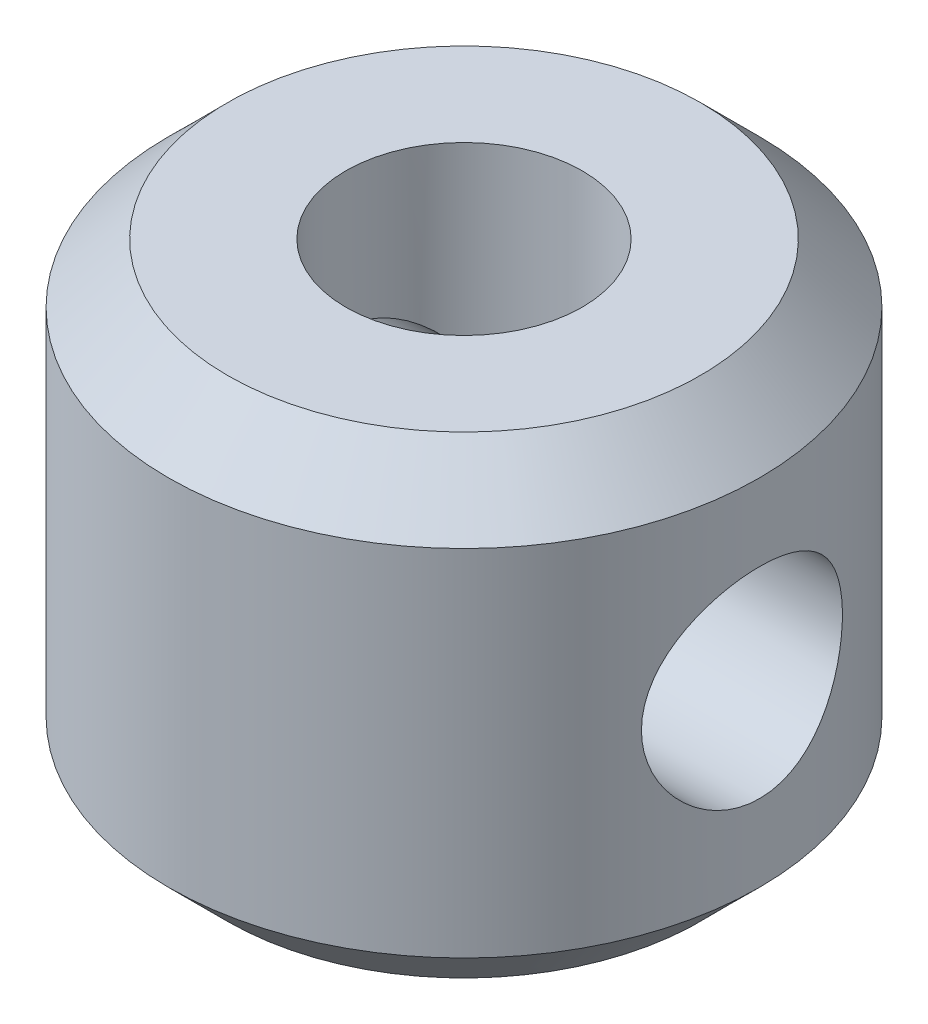
ISO-10303-21;
HEADER;
FILE_DESCRIPTION(('STEP AP214'),'2;1');
FILE_NAME('part.step','',(''),(''),'','','');
FILE_SCHEMA(('AUTOMOTIVE_DESIGN { 1 0 10303 214 1 1 1 1 }'));
ENDSEC;
DATA;
#1=APPLICATION_CONTEXT('core data for automotive mechanical design processes');
#2=APPLICATION_PROTOCOL_DEFINITION('international standard','automotive_design',2000,#1);
#3=PRODUCT_CONTEXT('',#1,'mechanical');
#4=PRODUCT('Part','Part','',(#3));
#5=PRODUCT_RELATED_PRODUCT_CATEGORY('part','',(#4));
#6=PRODUCT_DEFINITION_FORMATION('','',#4);
#7=PRODUCT_DEFINITION_CONTEXT('part definition',#1,'design');
#8=PRODUCT_DEFINITION('design','',#6,#7);
#9=PRODUCT_DEFINITION_SHAPE('','',#8);
#10=(LENGTH_UNIT() NAMED_UNIT(*) SI_UNIT(.MILLI.,.METRE.));
#11=(NAMED_UNIT(*) PLANE_ANGLE_UNIT() SI_UNIT($,.RADIAN.));
#12=(NAMED_UNIT(*) SI_UNIT($,.STERADIAN.) SOLID_ANGLE_UNIT());
#13=UNCERTAINTY_MEASURE_WITH_UNIT(LENGTH_MEASURE(1.E-05),#10,'distance_accuracy_value','');
#14=(GEOMETRIC_REPRESENTATION_CONTEXT(3) GLOBAL_UNCERTAINTY_ASSIGNED_CONTEXT((#13)) GLOBAL_UNIT_ASSIGNED_CONTEXT((#10,
#11,#12)) REPRESENTATION_CONTEXT('',''));
#15=CARTESIAN_POINT('',(0.,0.,0.));
#16=DIRECTION('',(0.,0.,1.));
#17=DIRECTION('',(1.,0.,0.));
#18=AXIS2_PLACEMENT_3D('',#15,#16,#17);
#19=CARTESIAN_POINT('',(0.,-8.,0.));
#20=DIRECTION('',(0.,1.,0.));
#21=DIRECTION('',(0.,0.,1.));
#22=AXIS2_PLACEMENT_3D('',#19,#20,#21);
#23=CYLINDRICAL_SURFACE('',#22,10.);
#24=CARTESIAN_POINT('',(0.,-6.,0.));
#25=DIRECTION('',(0.,1.,0.));
#26=DIRECTION('',(0.,0.,1.));
#27=AXIS2_PLACEMENT_3D('',#24,#25,#26);
#28=CIRCLE('',#27,10.);
#29=CARTESIAN_POINT('',(0.,-6.,10.));
#30=VERTEX_POINT('',#29);
#31=EDGE_CURVE('E51',#30,#30,#28,.T.);
#32=ORIENTED_EDGE('',*,*,#31,.T.);
#33=EDGE_LOOP('',(#32));
#34=FACE_BOUND('',#33,.T.);
#35=CARTESIAN_POINT('',(0.,5.99999999999998,0.));
#36=DIRECTION('',(0.,1.,0.));
#37=DIRECTION('',(0.,0.,1.));
#38=AXIS2_PLACEMENT_3D('',#35,#36,#37);
#39=CIRCLE('',#38,10.);
#40=CARTESIAN_POINT('',(0.,5.99999999999998,10.));
#41=VERTEX_POINT('',#40);
#42=EDGE_CURVE('E55',#41,#41,#39,.F.);
#43=ORIENTED_EDGE('',*,*,#42,.T.);
#44=EDGE_LOOP('',(#43));
#45=FACE_BOUND('',#44,.T.);
#46=CARTESIAN_POINT('',(-9.404254356407,0.,3.4));
#47=CARTESIAN_POINT('',(-9.40425304388512,-0.184953420483376,3.40000166908751));
#48=CARTESIAN_POINT('',(-9.40977016252886,-0.369895511118645,3.38485741847302));
#49=CARTESIAN_POINT('',(-9.43112195412395,-0.734285524505208,3.32489550119485));
#50=CARTESIAN_POINT('',(-9.44695798538134,-0.91373272069255,3.28007392801337));
#51=CARTESIAN_POINT('',(-9.486950978287,-1.26179216911297,3.16252582092778));
#52=CARTESIAN_POINT('',(-9.51109108494813,-1.43042555412138,3.08985577794442));
#53=CARTESIAN_POINT('',(-9.56494733634185,-1.75316390833695,2.91886772573691));
#54=CARTESIAN_POINT('',(-9.59466478704886,-1.90726546208992,2.82054370734523));
#55=CARTESIAN_POINT('',(-9.65768445866953,-2.20284172907647,2.59674934389341));
#56=CARTESIAN_POINT('',(-9.69107860913661,-2.34363869593089,2.47040953086171));
#57=CARTESIAN_POINT('',(-9.75691356862043,-2.60251129740331,2.19602382297905));
#58=CARTESIAN_POINT('',(-9.78935421670139,-2.72058311483184,2.04797428884779));
#59=CARTESIAN_POINT('',(-9.85069566679235,-2.93375754891921,1.72938686572475));
#60=CARTESIAN_POINT('',(-9.87947581186828,-3.02814598687088,1.558345814726));
#61=CARTESIAN_POINT('',(-9.92916704916357,-3.18654080889082,1.20166651255447));
#62=CARTESIAN_POINT('',(-9.95008035315213,-3.25055573382342,1.01603238201037));
#63=CARTESIAN_POINT('',(-9.98103018889156,-3.3440761479904,0.642545447140158));
#64=CARTESIAN_POINT('',(-9.99143197500353,-3.37474354767117,0.455014419274265));
#65=CARTESIAN_POINT('',(-10.0014854948076,-3.40439717563341,0.0771989450662025));
#66=CARTESIAN_POINT('',(-10.001140108762,-3.40339189225258,-0.113084749891811));
#67=CARTESIAN_POINT('',(-9.98998341494102,-3.37045649771206,-0.482764195543967));
#68=CARTESIAN_POINT('',(-9.97959952787043,-3.33978930884827,-0.662287492900011));
#69=CARTESIAN_POINT('',(-9.95007286837142,-3.25049458616494,-1.01346851094143));
#70=CARTESIAN_POINT('',(-9.93092949649604,-3.19186513876341,-1.18512569243209));
#71=CARTESIAN_POINT('',(-9.88550014200623,-3.04759669596916,-1.5184131226844));
#72=CARTESIAN_POINT('',(-9.85912183117114,-2.96160609055152,-1.67987806725566));
#73=CARTESIAN_POINT('',(-9.80195684021073,-2.7653489914145,-1.98645327362911));
#74=CARTESIAN_POINT('',(-9.77116890103816,-2.65507555955681,-2.13155884324518));
#75=CARTESIAN_POINT('',(-9.70664385807779,-2.40706037588067,-2.4087999391923));
#76=CARTESIAN_POINT('',(-9.67283615811297,-2.26823978575506,-2.53995535189234));
#77=CARTESIAN_POINT('',(-9.60734023658844,-1.97029791012476,-2.7774498614076));
#78=CARTESIAN_POINT('',(-9.57565237035916,-1.81117323414375,-2.88378480516894));
#79=CARTESIAN_POINT('',(-9.51758814230447,-1.47392005703157,-3.07005178456859));
#80=CARTESIAN_POINT('',(-9.49130084065409,-1.29553720080064,-3.14955318699025));
#81=CARTESIAN_POINT('',(-9.4480434513369,-0.926795423318427,-3.27705071712164));
#82=CARTESIAN_POINT('',(-9.43106926930757,-0.736441805910862,-3.32506069134676));
#83=CARTESIAN_POINT('',(-9.4092923936097,-0.358687922972768,-3.3861816778386));
#84=CARTESIAN_POINT('',(-9.40395811354865,-0.171565151773503,-3.40081833232186));
#85=CARTESIAN_POINT('',(-9.40457603744577,0.202499236177585,-3.39911130614408));
#86=CARTESIAN_POINT('',(-9.4105260837476,0.389440880724202,-3.3827735480466));
#87=CARTESIAN_POINT('',(-9.43251068789196,0.750767104370263,-3.32095449786326));
#88=CARTESIAN_POINT('',(-9.44817196310352,0.925361233510342,-3.27655084034138));
#89=CARTESIAN_POINT('',(-9.48739880028367,1.26457943002344,-3.16116303149792));
#90=CARTESIAN_POINT('',(-9.51096579870722,1.42920167910264,-3.09017404940011));
#91=CARTESIAN_POINT('',(-9.56430135308215,1.74976750453816,-2.92099798407743));
#92=CARTESIAN_POINT('',(-9.59424738815656,1.90525172592361,-2.82199797208764));
#93=CARTESIAN_POINT('',(-9.65662979681133,2.19795097623297,-2.6005224379063));
#94=CARTESIAN_POINT('',(-9.68906693101563,2.33516038994052,-2.47803972836567));
#95=CARTESIAN_POINT('',(-9.75475318078119,2.59456383577251,-2.20575180115405));
#96=CARTESIAN_POINT('',(-9.78796087549967,2.7156531552402,-2.05488096449369));
#97=CARTESIAN_POINT('',(-9.84984194395065,2.93087671469154,-1.73414271302249));
#98=CARTESIAN_POINT('',(-9.87851545856462,3.02501179224386,-1.56427588871584));
#99=CARTESIAN_POINT('',(-9.92797706666075,3.18281762815215,-1.21112598499961));
#100=CARTESIAN_POINT('',(-9.94881365774702,3.24667641013146,-1.02793408215332));
#101=CARTESIAN_POINT('',(-9.98045984572127,3.34240109335654,-0.652559201917854));
#102=CARTESIAN_POINT('',(-9.99127322503842,3.37427906347887,-0.460379644955186));
#103=CARTESIAN_POINT('',(-10.001357736856,3.4040167793745,-0.0825694640888703));
#104=CARTESIAN_POINT('',(-10.0011659900752,3.40345955105113,0.10292353681366));
#105=CARTESIAN_POINT('',(-9.99059617297391,3.37227320513031,0.471049997402429));
#106=CARTESIAN_POINT('',(-9.9802189859969,3.341646695324,0.653683703668664));
#107=CARTESIAN_POINT('',(-9.95064937449839,3.25225312728204,1.00778986749219));
#108=CARTESIAN_POINT('',(-9.93161057522011,3.19397575139756,1.17939969818483));
#109=CARTESIAN_POINT('',(-9.88667962779269,3.05139265740572,1.51046525092881));
#110=CARTESIAN_POINT('',(-9.86078622445031,2.9670821717273,1.6699187400548));
#111=CARTESIAN_POINT('',(-9.80358215465496,2.77115750937565,1.978731924377));
#112=CARTESIAN_POINT('',(-9.77210349983335,2.6586304284057,2.12748087355313));
#113=CARTESIAN_POINT('',(-9.70765952419128,2.41100145759273,2.40449800466576));
#114=CARTESIAN_POINT('',(-9.6746937219911,2.27589221921549,2.53275949305274));
#115=CARTESIAN_POINT('',(-9.60936753123022,1.98028554193501,2.77054216133791));
#116=CARTESIAN_POINT('',(-9.57708800752135,1.81897160206544,2.87907383901403));
#117=CARTESIAN_POINT('',(-9.51843865442494,1.47938230695654,3.06742609789492));
#118=CARTESIAN_POINT('',(-9.49206758113118,1.30111053313023,3.14725272451976));
#119=CARTESIAN_POINT('',(-9.44929298428447,0.938348484386956,3.27340630756408));
#120=CARTESIAN_POINT('',(-9.43259928285847,0.754235973509087,3.32071740887073));
#121=CARTESIAN_POINT('',(-9.41008272858581,0.380076784731426,3.38400738702497));
#122=CARTESIAN_POINT('',(-9.40425570497194,0.190032412041646,3.39999828507781));
#123=CARTESIAN_POINT('',(-9.404254356407,0.,3.4));
#124=B_SPLINE_CURVE_WITH_KNOTS('',3,(#46,#47,#48,#49,#50,#51,#52,#53,#54,#55,#56,#57,#58,#59,
#60,#61,#62,#63,#64,#65,#66,#67,#68,#69,#70,#71,#72,#73,#74,#75,#76,#77,#78,#79,#80,#81,#82,#83,
#84,#85,#86,#87,#88,#89,#90,#91,#92,#93,#94,#95,#96,#97,#98,#99,#100,#101,#102,#103,#104,#105,
#106,#107,#108,#109,#110,#111,#112,#113,#114,#115,#116,#117,#118,#119,#120,#121,#122,#123),
.UNSPECIFIED.,.T.,.F.,(4,2,2,2,2,2,2,2,2,2,2,2,2,2,2,2,2,2,2,2,2,2,2,2,2,2,2,2,2,2,2,2,2,2,2,2,
2,2,4),(0.,0.554155936307693,1.1083848323817,1.66149536988459,2.21473558407238,2.78843620567122,
3.36223310898812,3.95167753488287,4.54095611388212,5.10897071265926,5.67683308376751,
6.22153553621676,6.7662752704326,7.3183190052706,7.87052067629511,8.44970265346114,
9.02898147216689,9.61715795470361,10.2050756473347,10.7655266587632,11.3258705181364,
11.8659072222685,12.406042103245,12.9638264324961,13.5217817561255,14.1078464903069,
14.6938930112981,15.2762507491977,15.8583886349397,16.4121398132912,16.965842971211,
17.5100868450775,18.0544304481672,18.6193838234417,19.1845214012716,19.7729365795805,
20.3612277621793,20.9308199934137,21.500193562978),.UNSPECIFIED.);
#125=CARTESIAN_POINT('',(-9.404254356407,0.,3.4));
#126=VERTEX_POINT('',#125);
#127=EDGE_CURVE('E69',#126,#126,#124,.T.);
#128=ORIENTED_EDGE('',*,*,#127,.T.);
#129=EDGE_LOOP('',(#128));
#130=FACE_BOUND('',#129,.T.);
#131=CARTESIAN_POINT('',(9.404254356407,0.,3.4));
#132=CARTESIAN_POINT('',(9.40425304388512,0.184953420483376,3.40000166908751));
#133=CARTESIAN_POINT('',(9.40977016252886,0.369895511118645,3.38485741847302));
#134=CARTESIAN_POINT('',(9.43112195412395,0.734285524505208,3.32489550119485));
#135=CARTESIAN_POINT('',(9.44695798538134,0.91373272069255,3.28007392801337));
#136=CARTESIAN_POINT('',(9.486950978287,1.26179216911297,3.16252582092778));
#137=CARTESIAN_POINT('',(9.51109108494813,1.43042555412138,3.08985577794442));
#138=CARTESIAN_POINT('',(9.56494733634185,1.75316390833695,2.91886772573691));
#139=CARTESIAN_POINT('',(9.59466478704886,1.90726546208992,2.82054370734523));
#140=CARTESIAN_POINT('',(9.65768445866953,2.20284172907647,2.59674934389341));
#141=CARTESIAN_POINT('',(9.69107860913661,2.34363869593089,2.47040953086171));
#142=CARTESIAN_POINT('',(9.75691356862043,2.60251129740331,2.19602382297905));
#143=CARTESIAN_POINT('',(9.78935421670139,2.72058311483184,2.04797428884779));
#144=CARTESIAN_POINT('',(9.85069566679235,2.93375754891921,1.72938686572475));
#145=CARTESIAN_POINT('',(9.87947581186828,3.02814598687088,1.558345814726));
#146=CARTESIAN_POINT('',(9.92916704916357,3.18654080889082,1.20166651255447));
#147=CARTESIAN_POINT('',(9.95008035315213,3.25055573382342,1.01603238201037));
#148=CARTESIAN_POINT('',(9.98103018889156,3.3440761479904,0.642545447140158));
#149=CARTESIAN_POINT('',(9.99143197500353,3.37474354767117,0.455014419274265));
#150=CARTESIAN_POINT('',(10.0014854948076,3.40439717563341,0.0771989450662025));
#151=CARTESIAN_POINT('',(10.001140108762,3.40339189225258,-0.113084749891811));
#152=CARTESIAN_POINT('',(9.98998341494102,3.37045649771206,-0.482764195543967));
#153=CARTESIAN_POINT('',(9.97959952787043,3.33978930884827,-0.662287492900011));
#154=CARTESIAN_POINT('',(9.95007286837142,3.25049458616494,-1.01346851094143));
#155=CARTESIAN_POINT('',(9.93092949649604,3.19186513876341,-1.18512569243209));
#156=CARTESIAN_POINT('',(9.88550014200623,3.04759669596916,-1.5184131226844));
#157=CARTESIAN_POINT('',(9.85912183117114,2.96160609055152,-1.67987806725566));
#158=CARTESIAN_POINT('',(9.80195684021073,2.7653489914145,-1.98645327362911));
#159=CARTESIAN_POINT('',(9.77116890103816,2.65507555955681,-2.13155884324518));
#160=CARTESIAN_POINT('',(9.70664385807779,2.40706037588067,-2.4087999391923));
#161=CARTESIAN_POINT('',(9.67283615811297,2.26823978575506,-2.53995535189234));
#162=CARTESIAN_POINT('',(9.60734023658844,1.97029791012476,-2.7774498614076));
#163=CARTESIAN_POINT('',(9.57565237035916,1.81117323414375,-2.88378480516894));
#164=CARTESIAN_POINT('',(9.51758814230447,1.47392005703157,-3.07005178456859));
#165=CARTESIAN_POINT('',(9.49130084065409,1.29553720080064,-3.14955318699025));
#166=CARTESIAN_POINT('',(9.4480434513369,0.926795423318427,-3.27705071712164));
#167=CARTESIAN_POINT('',(9.43106926930757,0.736441805910862,-3.32506069134676));
#168=CARTESIAN_POINT('',(9.4092923936097,0.358687922972768,-3.3861816778386));
#169=CARTESIAN_POINT('',(9.40395811354865,0.171565151773503,-3.40081833232186));
#170=CARTESIAN_POINT('',(9.40457603744577,-0.202499236177585,-3.39911130614408));
#171=CARTESIAN_POINT('',(9.4105260837476,-0.389440880724202,-3.3827735480466));
#172=CARTESIAN_POINT('',(9.43251068789196,-0.750767104370263,-3.32095449786326));
#173=CARTESIAN_POINT('',(9.44817196310352,-0.925361233510342,-3.27655084034138));
#174=CARTESIAN_POINT('',(9.48739880028367,-1.26457943002344,-3.16116303149792));
#175=CARTESIAN_POINT('',(9.51096579870722,-1.42920167910264,-3.09017404940011));
#176=CARTESIAN_POINT('',(9.56430135308215,-1.74976750453816,-2.92099798407743));
#177=CARTESIAN_POINT('',(9.59424738815656,-1.90525172592361,-2.82199797208764));
#178=CARTESIAN_POINT('',(9.65662979681133,-2.19795097623297,-2.6005224379063));
#179=CARTESIAN_POINT('',(9.68906693101563,-2.33516038994052,-2.47803972836567));
#180=CARTESIAN_POINT('',(9.75475318078119,-2.59456383577251,-2.20575180115405));
#181=CARTESIAN_POINT('',(9.78796087549967,-2.7156531552402,-2.05488096449369));
#182=CARTESIAN_POINT('',(9.84984194395065,-2.93087671469154,-1.73414271302249));
#183=CARTESIAN_POINT('',(9.87851545856462,-3.02501179224386,-1.56427588871584));
#184=CARTESIAN_POINT('',(9.92797706666075,-3.18281762815215,-1.21112598499961));
#185=CARTESIAN_POINT('',(9.94881365774702,-3.24667641013146,-1.02793408215332));
#186=CARTESIAN_POINT('',(9.98045984572127,-3.34240109335654,-0.652559201917854));
#187=CARTESIAN_POINT('',(9.99127322503842,-3.37427906347887,-0.460379644955186));
#188=CARTESIAN_POINT('',(10.001357736856,-3.4040167793745,-0.0825694640888703));
#189=CARTESIAN_POINT('',(10.0011659900752,-3.40345955105113,0.10292353681366));
#190=CARTESIAN_POINT('',(9.99059617297391,-3.37227320513031,0.471049997402429));
#191=CARTESIAN_POINT('',(9.9802189859969,-3.341646695324,0.653683703668664));
#192=CARTESIAN_POINT('',(9.95064937449839,-3.25225312728204,1.00778986749219));
#193=CARTESIAN_POINT('',(9.93161057522011,-3.19397575139756,1.17939969818483));
#194=CARTESIAN_POINT('',(9.88667962779269,-3.05139265740572,1.51046525092881));
#195=CARTESIAN_POINT('',(9.86078622445031,-2.9670821717273,1.6699187400548));
#196=CARTESIAN_POINT('',(9.80358215465496,-2.77115750937565,1.978731924377));
#197=CARTESIAN_POINT('',(9.77210349983335,-2.6586304284057,2.12748087355313));
#198=CARTESIAN_POINT('',(9.70765952419128,-2.41100145759273,2.40449800466576));
#199=CARTESIAN_POINT('',(9.6746937219911,-2.27589221921549,2.53275949305274));
#200=CARTESIAN_POINT('',(9.60936753123022,-1.98028554193501,2.77054216133791));
#201=CARTESIAN_POINT('',(9.57708800752135,-1.81897160206544,2.87907383901403));
#202=CARTESIAN_POINT('',(9.51843865442494,-1.47938230695654,3.06742609789492));
#203=CARTESIAN_POINT('',(9.49206758113118,-1.30111053313023,3.14725272451976));
#204=CARTESIAN_POINT('',(9.44929298428447,-0.938348484386956,3.27340630756408));
#205=CARTESIAN_POINT('',(9.43259928285847,-0.754235973509087,3.32071740887073));
#206=CARTESIAN_POINT('',(9.41008272858581,-0.380076784731426,3.38400738702497));
#207=CARTESIAN_POINT('',(9.40425570497194,-0.190032412041646,3.39999828507781));
#208=CARTESIAN_POINT('',(9.404254356407,0.,3.4));
#209=B_SPLINE_CURVE_WITH_KNOTS('',3,(#131,#132,#133,#134,#135,#136,#137,#138,#139,#140,#141,
#142,#143,#144,#145,#146,#147,#148,#149,#150,#151,#152,#153,#154,#155,#156,#157,#158,#159,#160,
#161,#162,#163,#164,#165,#166,#167,#168,#169,#170,#171,#172,#173,#174,#175,#176,#177,#178,#179,
#180,#181,#182,#183,#184,#185,#186,#187,#188,#189,#190,#191,#192,#193,#194,#195,#196,#197,#198,
#199,#200,#201,#202,#203,#204,#205,#206,#207,#208),.UNSPECIFIED.,.T.,.F.,(4,2,2,2,2,2,2,2,2,2,2,
2,2,2,2,2,2,2,2,2,2,2,2,2,2,2,2,2,2,2,2,2,2,2,2,2,2,2,4),(0.,0.554155936307693,1.1083848323817,
1.66149536988459,2.21473558407238,2.78843620567122,3.36223310898812,3.95167753488287,
4.54095611388212,5.10897071265926,5.67683308376751,6.22153553621676,6.7662752704326,
7.3183190052706,7.87052067629511,8.44970265346114,9.02898147216689,9.61715795470361,
10.2050756473347,10.7655266587632,11.3258705181364,11.8659072222685,12.406042103245,
12.9638264324961,13.5217817561255,14.1078464903069,14.6938930112981,15.2762507491977,
15.8583886349397,16.4121398132912,16.965842971211,17.5100868450775,18.0544304481672,
18.6193838234417,19.1845214012716,19.7729365795805,20.3612277621793,20.9308199934137,
21.500193562978),.UNSPECIFIED.);
#210=CARTESIAN_POINT('',(9.404254356407,0.,3.4));
#211=VERTEX_POINT('',#210);
#212=EDGE_CURVE('E96',#211,#211,#209,.T.);
#213=ORIENTED_EDGE('',*,*,#212,.T.);
#214=EDGE_LOOP('',(#213));
#215=FACE_BOUND('',#214,.T.);
#216=ADVANCED_FACE('F39',(#34,#45,#130,#215),#23,.T.);
#217=CARTESIAN_POINT('',(0.,-8.,0.));
#218=DIRECTION('',(0.,1.,0.));
#219=DIRECTION('',(0.,0.,1.));
#220=AXIS2_PLACEMENT_3D('',#217,#218,#219);
#221=CYLINDRICAL_SURFACE('',#220,4.);
#222=CARTESIAN_POINT('',(0.,-8.,0.));
#223=DIRECTION('',(0.,1.,0.));
#224=DIRECTION('',(0.,0.,1.));
#225=AXIS2_PLACEMENT_3D('',#222,#223,#224);
#226=CIRCLE('',#225,4.);
#227=CARTESIAN_POINT('',(0.,-8.,4.));
#228=VERTEX_POINT('',#227);
#229=EDGE_CURVE('E60',#228,#228,#226,.T.);
#230=ORIENTED_EDGE('',*,*,#229,.F.);
#231=EDGE_LOOP('',(#230));
#232=FACE_BOUND('',#231,.T.);
#233=CARTESIAN_POINT('',(0.,8.,0.));
#234=DIRECTION('',(0.,1.,0.));
#235=DIRECTION('',(0.,0.,1.));
#236=AXIS2_PLACEMENT_3D('',#233,#234,#235);
#237=CIRCLE('',#236,4.);
#238=CARTESIAN_POINT('',(0.,8.,4.));
#239=VERTEX_POINT('',#238);
#240=EDGE_CURVE('E125',#239,#239,#237,.T.);
#241=ORIENTED_EDGE('',*,*,#240,.T.);
#242=EDGE_LOOP('',(#241));
#243=FACE_BOUND('',#242,.T.);
#244=CARTESIAN_POINT('',(-2.10713075057055,0.,3.4));
#245=CARTESIAN_POINT('',(-2.10713220198136,-0.0580178835389726,3.39999948488576));
#246=CARTESIAN_POINT('',(-2.10954216629292,-0.116054727352683,3.39850962735231));
#247=CARTESIAN_POINT('',(-2.1190356326308,-0.231609202363917,3.39259704276552));
#248=CARTESIAN_POINT('',(-2.12612232537134,-0.289126451889744,3.38817231337518));
#249=CARTESIAN_POINT('',(-2.15391990159423,-0.460469356508524,3.3706281180604));
#250=CARTESIAN_POINT('',(-2.1811658033444,-0.572833828182712,3.35323938805628));
#251=CARTESIAN_POINT('',(-2.26215132747778,-0.836067426228909,3.29936534022538));
#252=CARTESIAN_POINT('',(-2.32216929053496,-0.983886856232127,3.25797817080139));
#253=CARTESIAN_POINT('',(-2.45574432454046,-1.26743694408935,3.1585272401034));
#254=CARTESIAN_POINT('',(-2.52934711349439,-1.40312441337479,3.10040678380267));
#255=CARTESIAN_POINT('',(-2.66317907826633,-1.63053345217969,2.98550204646488));
#256=CARTESIAN_POINT('',(-2.72212423142382,-1.72473817316703,2.93204846034123));
#257=CARTESIAN_POINT('',(-2.84121775480121,-1.90717235102181,2.81679715938763));
#258=CARTESIAN_POINT('',(-2.90136668111604,-1.99539895966204,2.75499550858016));
#259=CARTESIAN_POINT('',(-3.02105195805551,-2.16573580994192,2.62319726064066));
#260=CARTESIAN_POINT('',(-3.08058896538287,-2.24785336812471,2.5532107333771));
#261=CARTESIAN_POINT('',(-3.1976684264421,-2.4058028155244,2.40496273333029));
#262=CARTESIAN_POINT('',(-3.25521068139721,-2.48163407935469,2.32670043899767));
#263=CARTESIAN_POINT('',(-3.39824268116359,-2.66706709273329,2.11566966064534));
#264=CARTESIAN_POINT('',(-3.48135766809598,-2.77182752304548,1.97690270227101));
#265=CARTESIAN_POINT('',(-3.63404291116767,-2.96131519956835,1.67974533103022));
#266=CARTESIAN_POINT('',(-3.70363551508326,-3.04607554950066,1.52138801559193));
#267=CARTESIAN_POINT('',(-3.81315867731919,-3.17825181008133,1.21700738375939));
#268=CARTESIAN_POINT('',(-3.85616669128563,-3.22963327926221,1.07382951435015));
#269=CARTESIAN_POINT('',(-3.92648784129073,-3.31327980060483,0.778274285903939));
#270=CARTESIAN_POINT('',(-3.95381016751541,-3.34555604679056,0.625902371578812));
#271=CARTESIAN_POINT('',(-3.99063252399514,-3.38899439827928,0.315283395039914));
#272=CARTESIAN_POINT('',(-4.00005070127079,-3.40005953397708,0.157012706744631));
#273=CARTESIAN_POINT('',(-3.9999489083384,-3.39994000673021,-0.159512303148223));
#274=CARTESIAN_POINT('',(-3.99043048958587,-3.38875716653896,-0.317766625024363));
#275=CARTESIAN_POINT('',(-3.9547221692333,-3.34663088804681,-0.617474873750964));
#276=CARTESIAN_POINT('',(-3.92981818992482,-3.31721110117617,-0.759305388987331));
#277=CARTESIAN_POINT('',(-3.86632021211538,-3.24173500193553,-1.03519343312991));
#278=CARTESIAN_POINT('',(-3.82772406248851,-3.1956760754314,-1.16924973680615));
#279=CARTESIAN_POINT('',(-3.7356369664482,-3.08480454491678,-1.43760416189277));
#280=CARTESIAN_POINT('',(-3.68120835590218,-3.01879543547548,-1.57108031885552));
#281=CARTESIAN_POINT('',(-3.56219725599376,-2.87246290419708,-1.82495784887739));
#282=CARTESIAN_POINT('',(-3.4976068373122,-2.79212829750136,-1.94534888644973));
#283=CARTESIAN_POINT('',(-3.32733210808027,-2.57635167504369,-2.22891196900937));
#284=CARTESIAN_POINT('',(-3.21714822508461,-2.43333219732296,-2.38370955852588));
#285=CARTESIAN_POINT('',(-3.04716940764508,-2.2018054178424,-2.59285823410317));
#286=CARTESIAN_POINT('',(-2.98963176127111,-2.12165740196483,-2.65881866955993));
#287=CARTESIAN_POINT('',(-2.87429043884486,-1.95579076472385,-2.78309427110182));
#288=CARTESIAN_POINT('',(-2.81648685452516,-1.87007394735858,-2.84141189476573));
#289=CARTESIAN_POINT('',(-2.71527173680537,-1.71330389301848,-2.93785865410992));
#290=CARTESIAN_POINT('',(-2.67159160022524,-1.64337941927367,-2.97755492947728));
#291=CARTESIAN_POINT('',(-2.58591449770695,-1.5000852878381,-3.05225681193827));
#292=CARTESIAN_POINT('',(-2.5439171517255,-1.4267164162553,-3.08726348237027));
#293=CARTESIAN_POINT('',(-2.46281668894257,-1.27650088333992,-3.15233716734781));
#294=CARTESIAN_POINT('',(-2.42370724402198,-1.19966245889893,-3.18241516966257));
#295=CARTESIAN_POINT('',(-2.3497609538181,-1.04221145174088,-3.23739801855761));
#296=CARTESIAN_POINT('',(-2.31492156365088,-0.96160115697514,-3.26230595261546));
#297=CARTESIAN_POINT('',(-2.24348847099012,-0.776056151027535,-3.31196114925028));
#298=CARTESIAN_POINT('',(-2.2085790833942,-0.670023367293102,-3.33515547878589));
#299=CARTESIAN_POINT('',(-2.15269639084892,-0.452796371927327,-3.37150360687883));
#300=CARTESIAN_POINT('',(-2.13168787517556,-0.341615970270216,-3.38468278636273));
#301=CARTESIAN_POINT('',(-2.10727973857503,-0.115380791596845,-3.39994352872494));
#302=CARTESIAN_POINT('',(-2.10404741879731,-0.000299427161138863,-3.40191965913518));
#303=CARTESIAN_POINT('',(-2.11638756301298,0.228491354119423,-3.39425047718277));
#304=CARTESIAN_POINT('',(-2.13197986549405,0.342199195827949,-3.38459290456746));
#305=CARTESIAN_POINT('',(-2.18349600695417,0.587233205185536,-3.35162895745627));
#306=CARTESIAN_POINT('',(-2.22289397784034,0.717471690096932,-3.32595723783552));
#307=CARTESIAN_POINT('',(-2.31639077921188,0.969272820487449,-3.26152283221549));
#308=CARTESIAN_POINT('',(-2.37054075358179,1.09080338976839,-3.22271448701767));
#309=CARTESIAN_POINT('',(-2.4767843863017,1.30438045970096,-3.14152920080571));
#310=CARTESIAN_POINT('',(-2.52753762434433,1.39783192411267,-3.10100773799877));
#311=CARTESIAN_POINT('',(-2.63227257156256,1.57935487657955,-3.01261301974822));
#312=CARTESIAN_POINT('',(-2.6862562127596,1.66742308009907,-2.96473533735852));
#313=CARTESIAN_POINT('',(-2.79566625039868,1.83849675294466,-2.86180103801339));
#314=CARTESIAN_POINT('',(-2.85109445060732,1.92149541291972,-2.80673506412872));
#315=CARTESIAN_POINT('',(-2.96189493002539,2.08235842308389,-2.68955045078885));
#316=CARTESIAN_POINT('',(-3.01726721879741,2.16022388957077,-2.62743335276798));
#317=CARTESIAN_POINT('',(-3.12907712608666,2.31387415672972,-2.49335411139756));
#318=CARTESIAN_POINT('',(-3.18546127596425,2.38943292787439,-2.42108736232709));
#319=CARTESIAN_POINT('',(-3.29564466420659,2.53446128356469,-2.26882370233847));
#320=CARTESIAN_POINT('',(-3.34944340699387,2.60392970278301,-2.18882531817969));
#321=CARTESIAN_POINT('',(-3.45308297357736,2.73595467529065,-2.02135697683104));
#322=CARTESIAN_POINT('',(-3.5029344532121,2.79853002905133,-1.93390855737351));
#323=CARTESIAN_POINT('',(-3.59759447871482,2.91614503729325,-1.75153427710551));
#324=CARTESIAN_POINT('',(-3.64240349771257,2.97118539888149,-1.65660911925418));
#325=CARTESIAN_POINT('',(-3.74108408803043,3.09148785035505,-1.42326967938998));
#326=CARTESIAN_POINT('',(-3.79220956951969,3.15304142396,-1.28172077544037));
#327=CARTESIAN_POINT('',(-3.87926014341682,3.25721969035625,-0.98732144077011));
#328=CARTESIAN_POINT('',(-3.91519655592533,3.29985848112446,-0.834479526661268));
#329=CARTESIAN_POINT('',(-3.95567699349252,3.34775265923518,-0.599213078796743));
#330=CARTESIAN_POINT('',(-3.96694964393807,3.36105915875181,-0.519483389761346));
#331=CARTESIAN_POINT('',(-3.9846963878376,3.38198723091517,-0.358767940432974));
#332=CARTESIAN_POINT('',(-3.99117267273244,3.38961139980688,-0.277782771053219));
#333=CARTESIAN_POINT('',(-3.99916776706347,3.39902177212685,-0.115230789362744));
#334=CARTESIAN_POINT('',(-4.00068674576637,3.40080817488503,-0.0336639970067918));
#335=CARTESIAN_POINT('',(-3.9987415579746,3.39851923206439,0.129302961272916));
#336=CARTESIAN_POINT('',(-3.99527773985392,3.3944442962831,0.210703138447177));
#337=CARTESIAN_POINT('',(-3.97863923442288,3.37485182563905,0.438041213252387));
#338=CARTESIAN_POINT('',(-3.95988597037338,3.35275661143921,0.583086320126382));
#339=CARTESIAN_POINT('',(-3.90768846654406,3.29094171987882,0.866490346114819));
#340=CARTESIAN_POINT('',(-3.874241062955,3.25121824694233,1.00484781818297));
#341=CARTESIAN_POINT('',(-3.79307685504558,3.15407377499418,1.27819256771711));
#342=CARTESIAN_POINT('',(-3.74479187425385,3.09594462289788,1.41275669092716));
#343=CARTESIAN_POINT('',(-3.63744755302222,2.9651987476979,1.66986249855564));
#344=CARTESIAN_POINT('',(-3.57838550293934,2.89257838068514,1.79240114750636));
#345=CARTESIAN_POINT('',(-3.42180022297476,2.69698147606951,2.08076246189959));
#346=CARTESIAN_POINT('',(-3.31945154643866,2.56659547806953,2.23901458332055));
#347=CARTESIAN_POINT('',(-3.15925310212694,2.35436046205186,2.45504766978143));
#348=CARTESIAN_POINT('',(-3.10459268752466,2.28062944772788,2.5236489959156));
#349=CARTESIAN_POINT('',(-2.99417613739258,2.1278829055372,2.65370736049471));
#350=CARTESIAN_POINT('',(-2.93842045796098,2.04886954576818,2.71516730204801));
#351=CARTESIAN_POINT('',(-2.82595254616454,1.88406799916171,2.83208485730627));
#352=CARTESIAN_POINT('',(-2.76924325539598,1.79817658054243,2.88739937597092));
#353=CARTESIAN_POINT('',(-2.65752238192705,1.62085621846026,2.99054369334496));
#354=CARTESIAN_POINT('',(-2.60251179495426,1.52942411686296,3.03836916664409));
#355=CARTESIAN_POINT('',(-2.49652925861635,1.34115416975438,3.1260270299979));
#356=CARTESIAN_POINT('',(-2.44554059976058,1.24434188748706,3.16589367328309));
#357=CARTESIAN_POINT('',(-2.35023362496694,1.0446427026427,3.23727348042674));
#358=CARTESIAN_POINT('',(-2.30590534518636,0.941765201187659,3.26879917710046));
#359=CARTESIAN_POINT('',(-2.22791380895157,0.730214591571439,3.32244379319814));
#360=CARTESIAN_POINT('',(-2.19419576698649,0.621574756650255,3.34461124345634));
#361=CARTESIAN_POINT('',(-2.14195202890763,0.399296999379567,3.37832129122034));
#362=CARTESIAN_POINT('',(-2.12336102481558,0.285682818334288,3.38990958885913));
#363=CARTESIAN_POINT('',(-2.1117646901253,0.142730621884544,3.39712378029847));
#364=CARTESIAN_POINT('',(-2.1100312369337,0.11423025520326,3.39820078016936));
#365=CARTESIAN_POINT('',(-2.10771376156281,0.0571548041960342,3.39963910911082));
#366=CARTESIAN_POINT('',(-2.10713003560325,0.0285797025134597,3.4000002537461));
#367=CARTESIAN_POINT('',(-2.10713075057055,0.,3.4));
#368=B_SPLINE_CURVE_WITH_KNOTS('',3,(#244,#245,#246,#247,#248,#249,#250,#251,#252,#253,#254,
#255,#256,#257,#258,#259,#260,#261,#262,#263,#264,#265,#266,#267,#268,#269,#270,#271,#272,#273,
#274,#275,#276,#277,#278,#279,#280,#281,#282,#283,#284,#285,#286,#287,#288,#289,#290,#291,#292,
#293,#294,#295,#296,#297,#298,#299,#300,#301,#302,#303,#304,#305,#306,#307,#308,#309,#310,#311,
#312,#313,#314,#315,#316,#317,#318,#319,#320,#321,#322,#323,#324,#325,#326,#327,#328,#329,#330,
#331,#332,#333,#334,#335,#336,#337,#338,#339,#340,#341,#342,#343,#344,#345,#346,#347,#348,#349,
#350,#351,#352,#353,#354,#355,#356,#357,#358,#359,#360,#361,#362,#363,#364,#365,#366,#367),
.UNSPECIFIED.,.T.,.F.,(4,2,2,2,2,2,2,2,2,2,2,2,2,2,2,2,2,2,2,2,2,2,2,2,2,2,2,2,2,2,2,2,2,2,2,2,
2,2,2,2,2,2,2,2,2,2,2,2,2,2,2,2,2,2,2,2,2,2,2,2,2,4),(0.,0.17401630718213,0.348151460503648,
0.697166883746873,1.18894045517013,1.68240024693048,2.05192317154046,2.42162093234526,
2.79086854570984,3.16015284938286,3.7360348636136,4.31095689653065,4.78323654732981,
5.25523920810314,5.72939459749724,6.20351114143575,6.64254018447999,7.08163823231073,
7.55551764514857,8.02976867983915,8.73909788160568,9.09488331175795,9.45055405540719,
9.72489712947248,9.99917789230555,10.2728386115645,10.5463354320622,10.8872462597105,
11.2272902249738,11.5705291156834,11.9141300475763,12.327221395524,12.7417635319096,
13.0827400459008,13.423922567893,13.7655537169205,14.1071103258485,14.4630632267369,
14.8190840876453,15.1741085333782,15.5290996396469,16.014918639584,16.5003749274382,
16.7449235382275,16.9893603466551,17.2337888087258,17.4782001823259,17.9197159575429,
18.3613268425699,18.8225668260407,19.2839229377529,19.9674353649361,20.3109525419382,
20.6543295804759,21.0045117596903,21.354895451758,21.7037370129651,22.052051401347,
22.3985365949521,22.7435178498774,22.8292164851734,22.9149371972779),.UNSPECIFIED.);
#369=CARTESIAN_POINT('',(-2.10713075057055,0.,3.4));
#370=VERTEX_POINT('',#369);
#371=EDGE_CURVE('E70',#370,#370,#368,.T.);
#372=ORIENTED_EDGE('',*,*,#371,.F.);
#373=EDGE_LOOP('',(#372));
#374=FACE_BOUND('',#373,.T.);
#375=CARTESIAN_POINT('',(2.10713075057055,0.,3.4));
#376=CARTESIAN_POINT('',(2.10713220198136,0.0580178835389726,3.39999948488576));
#377=CARTESIAN_POINT('',(2.10954216629292,0.116054727352683,3.39850962735231));
#378=CARTESIAN_POINT('',(2.1190356326308,0.231609202363917,3.39259704276552));
#379=CARTESIAN_POINT('',(2.12612232537134,0.289126451889744,3.38817231337518));
#380=CARTESIAN_POINT('',(2.15391990159423,0.460469356508524,3.3706281180604));
#381=CARTESIAN_POINT('',(2.1811658033444,0.572833828182712,3.35323938805628));
#382=CARTESIAN_POINT('',(2.26215132747778,0.836067426228909,3.29936534022538));
#383=CARTESIAN_POINT('',(2.32216929053496,0.983886856232127,3.25797817080139));
#384=CARTESIAN_POINT('',(2.45574432454046,1.26743694408935,3.1585272401034));
#385=CARTESIAN_POINT('',(2.52934711349439,1.40312441337479,3.10040678380267));
#386=CARTESIAN_POINT('',(2.66317907826633,1.63053345217969,2.98550204646488));
#387=CARTESIAN_POINT('',(2.72212423142382,1.72473817316703,2.93204846034123));
#388=CARTESIAN_POINT('',(2.84121775480121,1.90717235102181,2.81679715938763));
#389=CARTESIAN_POINT('',(2.90136668111604,1.99539895966204,2.75499550858016));
#390=CARTESIAN_POINT('',(3.02105195805551,2.16573580994192,2.62319726064066));
#391=CARTESIAN_POINT('',(3.08058896538287,2.24785336812471,2.5532107333771));
#392=CARTESIAN_POINT('',(3.1976684264421,2.4058028155244,2.40496273333029));
#393=CARTESIAN_POINT('',(3.25521068139721,2.48163407935469,2.32670043899767));
#394=CARTESIAN_POINT('',(3.39824268116359,2.66706709273329,2.11566966064534));
#395=CARTESIAN_POINT('',(3.48135766809598,2.77182752304548,1.97690270227101));
#396=CARTESIAN_POINT('',(3.63404291116767,2.96131519956835,1.67974533103022));
#397=CARTESIAN_POINT('',(3.70363551508326,3.04607554950066,1.52138801559193));
#398=CARTESIAN_POINT('',(3.81315867731919,3.17825181008133,1.21700738375939));
#399=CARTESIAN_POINT('',(3.85616669128563,3.22963327926221,1.07382951435015));
#400=CARTESIAN_POINT('',(3.92648784129073,3.31327980060483,0.778274285903939));
#401=CARTESIAN_POINT('',(3.95381016751541,3.34555604679056,0.625902371578812));
#402=CARTESIAN_POINT('',(3.99063252399514,3.38899439827928,0.315283395039914));
#403=CARTESIAN_POINT('',(4.00005070127079,3.40005953397708,0.157012706744631));
#404=CARTESIAN_POINT('',(3.9999489083384,3.39994000673021,-0.159512303148223));
#405=CARTESIAN_POINT('',(3.99043048958587,3.38875716653896,-0.317766625024363));
#406=CARTESIAN_POINT('',(3.9547221692333,3.34663088804681,-0.617474873750964));
#407=CARTESIAN_POINT('',(3.92981818992482,3.31721110117617,-0.759305388987331));
#408=CARTESIAN_POINT('',(3.86632021211538,3.24173500193553,-1.03519343312991));
#409=CARTESIAN_POINT('',(3.82772406248851,3.1956760754314,-1.16924973680615));
#410=CARTESIAN_POINT('',(3.7356369664482,3.08480454491678,-1.43760416189277));
#411=CARTESIAN_POINT('',(3.68120835590218,3.01879543547548,-1.57108031885552));
#412=CARTESIAN_POINT('',(3.56219725599376,2.87246290419708,-1.82495784887739));
#413=CARTESIAN_POINT('',(3.4976068373122,2.79212829750136,-1.94534888644973));
#414=CARTESIAN_POINT('',(3.32733210808027,2.57635167504369,-2.22891196900937));
#415=CARTESIAN_POINT('',(3.21714822508461,2.43333219732296,-2.38370955852588));
#416=CARTESIAN_POINT('',(3.04716940764508,2.2018054178424,-2.59285823410317));
#417=CARTESIAN_POINT('',(2.98963176127111,2.12165740196483,-2.65881866955993));
#418=CARTESIAN_POINT('',(2.87429043884486,1.95579076472385,-2.78309427110182));
#419=CARTESIAN_POINT('',(2.81648685452516,1.87007394735858,-2.84141189476573));
#420=CARTESIAN_POINT('',(2.71527173680537,1.71330389301848,-2.93785865410992));
#421=CARTESIAN_POINT('',(2.67159160022524,1.64337941927367,-2.97755492947728));
#422=CARTESIAN_POINT('',(2.58591449770695,1.5000852878381,-3.05225681193827));
#423=CARTESIAN_POINT('',(2.5439171517255,1.4267164162553,-3.08726348237027));
#424=CARTESIAN_POINT('',(2.46281668894257,1.27650088333992,-3.15233716734781));
#425=CARTESIAN_POINT('',(2.42370724402198,1.19966245889893,-3.18241516966257));
#426=CARTESIAN_POINT('',(2.3497609538181,1.04221145174088,-3.23739801855761));
#427=CARTESIAN_POINT('',(2.31492156365088,0.96160115697514,-3.26230595261546));
#428=CARTESIAN_POINT('',(2.24348847099012,0.776056151027535,-3.31196114925028));
#429=CARTESIAN_POINT('',(2.2085790833942,0.670023367293102,-3.33515547878589));
#430=CARTESIAN_POINT('',(2.15269639084892,0.452796371927327,-3.37150360687883));
#431=CARTESIAN_POINT('',(2.13168787517556,0.341615970270216,-3.38468278636273));
#432=CARTESIAN_POINT('',(2.10727973857503,0.115380791596845,-3.39994352872494));
#433=CARTESIAN_POINT('',(2.10404741879731,0.000299427161138863,-3.40191965913518));
#434=CARTESIAN_POINT('',(2.11638756301298,-0.228491354119423,-3.39425047718277));
#435=CARTESIAN_POINT('',(2.13197986549405,-0.342199195827949,-3.38459290456746));
#436=CARTESIAN_POINT('',(2.18349600695417,-0.587233205185536,-3.35162895745627));
#437=CARTESIAN_POINT('',(2.22289397784034,-0.717471690096932,-3.32595723783552));
#438=CARTESIAN_POINT('',(2.31639077921188,-0.969272820487449,-3.26152283221549));
#439=CARTESIAN_POINT('',(2.37054075358179,-1.09080338976839,-3.22271448701767));
#440=CARTESIAN_POINT('',(2.4767843863017,-1.30438045970096,-3.14152920080571));
#441=CARTESIAN_POINT('',(2.52753762434433,-1.39783192411267,-3.10100773799877));
#442=CARTESIAN_POINT('',(2.63227257156256,-1.57935487657955,-3.01261301974822));
#443=CARTESIAN_POINT('',(2.6862562127596,-1.66742308009907,-2.96473533735852));
#444=CARTESIAN_POINT('',(2.79566625039868,-1.83849675294466,-2.86180103801339));
#445=CARTESIAN_POINT('',(2.85109445060732,-1.92149541291972,-2.80673506412872));
#446=CARTESIAN_POINT('',(2.96189493002539,-2.08235842308389,-2.68955045078885));
#447=CARTESIAN_POINT('',(3.01726721879741,-2.16022388957077,-2.62743335276798));
#448=CARTESIAN_POINT('',(3.12907712608666,-2.31387415672972,-2.49335411139756));
#449=CARTESIAN_POINT('',(3.18546127596425,-2.38943292787439,-2.42108736232709));
#450=CARTESIAN_POINT('',(3.29564466420659,-2.53446128356469,-2.26882370233847));
#451=CARTESIAN_POINT('',(3.34944340699387,-2.60392970278301,-2.18882531817969));
#452=CARTESIAN_POINT('',(3.45308297357736,-2.73595467529065,-2.02135697683104));
#453=CARTESIAN_POINT('',(3.5029344532121,-2.79853002905133,-1.93390855737351));
#454=CARTESIAN_POINT('',(3.59759447871482,-2.91614503729325,-1.75153427710551));
#455=CARTESIAN_POINT('',(3.64240349771257,-2.97118539888149,-1.65660911925418));
#456=CARTESIAN_POINT('',(3.74108408803043,-3.09148785035505,-1.42326967938998));
#457=CARTESIAN_POINT('',(3.79220956951969,-3.15304142396,-1.28172077544037));
#458=CARTESIAN_POINT('',(3.87926014341682,-3.25721969035625,-0.98732144077011));
#459=CARTESIAN_POINT('',(3.91519655592533,-3.29985848112446,-0.834479526661268));
#460=CARTESIAN_POINT('',(3.95567699349252,-3.34775265923518,-0.599213078796743));
#461=CARTESIAN_POINT('',(3.96694964393807,-3.36105915875181,-0.519483389761346));
#462=CARTESIAN_POINT('',(3.9846963878376,-3.38198723091517,-0.358767940432974));
#463=CARTESIAN_POINT('',(3.99117267273244,-3.38961139980688,-0.277782771053219));
#464=CARTESIAN_POINT('',(3.99916776706347,-3.39902177212685,-0.115230789362744));
#465=CARTESIAN_POINT('',(4.00068674576637,-3.40080817488503,-0.0336639970067918));
#466=CARTESIAN_POINT('',(3.9987415579746,-3.39851923206439,0.129302961272916));
#467=CARTESIAN_POINT('',(3.99527773985392,-3.3944442962831,0.210703138447177));
#468=CARTESIAN_POINT('',(3.97863923442288,-3.37485182563905,0.438041213252387));
#469=CARTESIAN_POINT('',(3.95988597037338,-3.35275661143921,0.583086320126382));
#470=CARTESIAN_POINT('',(3.90768846654406,-3.29094171987882,0.866490346114819));
#471=CARTESIAN_POINT('',(3.874241062955,-3.25121824694233,1.00484781818297));
#472=CARTESIAN_POINT('',(3.79307685504558,-3.15407377499418,1.27819256771711));
#473=CARTESIAN_POINT('',(3.74479187425385,-3.09594462289788,1.41275669092716));
#474=CARTESIAN_POINT('',(3.63744755302222,-2.9651987476979,1.66986249855564));
#475=CARTESIAN_POINT('',(3.57838550293934,-2.89257838068514,1.79240114750636));
#476=CARTESIAN_POINT('',(3.42180022297476,-2.69698147606951,2.08076246189959));
#477=CARTESIAN_POINT('',(3.31945154643866,-2.56659547806953,2.23901458332055));
#478=CARTESIAN_POINT('',(3.15925310212694,-2.35436046205186,2.45504766978143));
#479=CARTESIAN_POINT('',(3.10459268752466,-2.28062944772788,2.5236489959156));
#480=CARTESIAN_POINT('',(2.99417613739258,-2.1278829055372,2.65370736049471));
#481=CARTESIAN_POINT('',(2.93842045796098,-2.04886954576818,2.71516730204801));
#482=CARTESIAN_POINT('',(2.82595254616454,-1.88406799916171,2.83208485730627));
#483=CARTESIAN_POINT('',(2.76924325539598,-1.79817658054243,2.88739937597092));
#484=CARTESIAN_POINT('',(2.65752238192705,-1.62085621846026,2.99054369334496));
#485=CARTESIAN_POINT('',(2.60251179495426,-1.52942411686296,3.03836916664409));
#486=CARTESIAN_POINT('',(2.49652925861635,-1.34115416975438,3.1260270299979));
#487=CARTESIAN_POINT('',(2.44554059976058,-1.24434188748706,3.16589367328309));
#488=CARTESIAN_POINT('',(2.35023362496694,-1.0446427026427,3.23727348042674));
#489=CARTESIAN_POINT('',(2.30590534518636,-0.941765201187659,3.26879917710046));
#490=CARTESIAN_POINT('',(2.22791380895157,-0.730214591571439,3.32244379319814));
#491=CARTESIAN_POINT('',(2.19419576698649,-0.621574756650255,3.34461124345634));
#492=CARTESIAN_POINT('',(2.14195202890763,-0.399296999379567,3.37832129122034));
#493=CARTESIAN_POINT('',(2.12336102481558,-0.285682818334288,3.38990958885913));
#494=CARTESIAN_POINT('',(2.1117646901253,-0.142730621884544,3.39712378029847));
#495=CARTESIAN_POINT('',(2.1100312369337,-0.11423025520326,3.39820078016936));
#496=CARTESIAN_POINT('',(2.10771376156281,-0.0571548041960342,3.39963910911082));
#497=CARTESIAN_POINT('',(2.10713003560325,-0.0285797025134597,3.4000002537461));
#498=CARTESIAN_POINT('',(2.10713075057055,0.,3.4));
#499=B_SPLINE_CURVE_WITH_KNOTS('',3,(#375,#376,#377,#378,#379,#380,#381,#382,#383,#384,#385,
#386,#387,#388,#389,#390,#391,#392,#393,#394,#395,#396,#397,#398,#399,#400,#401,#402,#403,#404,
#405,#406,#407,#408,#409,#410,#411,#412,#413,#414,#415,#416,#417,#418,#419,#420,#421,#422,#423,
#424,#425,#426,#427,#428,#429,#430,#431,#432,#433,#434,#435,#436,#437,#438,#439,#440,#441,#442,
#443,#444,#445,#446,#447,#448,#449,#450,#451,#452,#453,#454,#455,#456,#457,#458,#459,#460,#461,
#462,#463,#464,#465,#466,#467,#468,#469,#470,#471,#472,#473,#474,#475,#476,#477,#478,#479,#480,
#481,#482,#483,#484,#485,#486,#487,#488,#489,#490,#491,#492,#493,#494,#495,#496,#497,#498),
.UNSPECIFIED.,.T.,.F.,(4,2,2,2,2,2,2,2,2,2,2,2,2,2,2,2,2,2,2,2,2,2,2,2,2,2,2,2,2,2,2,2,2,2,2,2,
2,2,2,2,2,2,2,2,2,2,2,2,2,2,2,2,2,2,2,2,2,2,2,2,2,4),(0.,0.17401630718213,0.348151460503648,
0.697166883746873,1.18894045517013,1.68240024693048,2.05192317154046,2.42162093234526,
2.79086854570984,3.16015284938286,3.7360348636136,4.31095689653065,4.78323654732981,
5.25523920810314,5.72939459749724,6.20351114143575,6.64254018447999,7.08163823231073,
7.55551764514857,8.02976867983915,8.73909788160568,9.09488331175795,9.45055405540719,
9.72489712947248,9.99917789230555,10.2728386115645,10.5463354320622,10.8872462597105,
11.2272902249738,11.5705291156834,11.9141300475763,12.327221395524,12.7417635319096,
13.0827400459008,13.423922567893,13.7655537169205,14.1071103258485,14.4630632267369,
14.8190840876453,15.1741085333782,15.5290996396469,16.014918639584,16.5003749274382,
16.7449235382275,16.9893603466551,17.2337888087258,17.4782001823259,17.9197159575429,
18.3613268425699,18.8225668260407,19.2839229377529,19.9674353649361,20.3109525419382,
20.6543295804759,21.0045117596903,21.354895451758,21.7037370129651,22.052051401347,
22.3985365949521,22.7435178498774,22.8292164851734,22.9149371972779),.UNSPECIFIED.);
#500=CARTESIAN_POINT('',(2.10713075057055,0.,3.4));
#501=VERTEX_POINT('',#500);
#502=EDGE_CURVE('E61',#501,#501,#499,.T.);
#503=ORIENTED_EDGE('',*,*,#502,.F.);
#504=EDGE_LOOP('',(#503));
#505=FACE_BOUND('',#504,.T.);
#506=ADVANCED_FACE('F75',(#232,#243,#374,#505),#221,.F.);
#507=CARTESIAN_POINT('',(0.,-8.,0.));
#508=DIRECTION('',(0.,1.,0.));
#509=DIRECTION('',(0.,0.,1.));
#510=AXIS2_PLACEMENT_3D('',#507,#508,#509);
#511=PLANE('',#510);
#512=CARTESIAN_POINT('',(0.,-8.,0.));
#513=DIRECTION('',(0.,1.,0.));
#514=DIRECTION('',(0.,0.,1.));
#515=AXIS2_PLACEMENT_3D('',#512,#513,#514);
#516=CIRCLE('',#515,7.99999999999999);
#517=CARTESIAN_POINT('',(0.,-8.,7.99999999999999));
#518=VERTEX_POINT('',#517);
#519=EDGE_CURVE('E47',#518,#518,#516,.F.);
#520=ORIENTED_EDGE('',*,*,#519,.T.);
#521=EDGE_LOOP('',(#520));
#522=FACE_BOUND('',#521,.T.);
#523=ORIENTED_EDGE('',*,*,#229,.T.);
#524=EDGE_LOOP('',(#523));
#525=FACE_BOUND('',#524,.T.);
#526=ADVANCED_FACE('F104',(#522,#525),#511,.F.);
#527=CARTESIAN_POINT('',(0.,8.,0.));
#528=DIRECTION('',(0.,1.,0.));
#529=DIRECTION('',(0.,0.,1.));
#530=AXIS2_PLACEMENT_3D('',#527,#528,#529);
#531=PLANE('',#530);
#532=CARTESIAN_POINT('',(0.,8.,0.));
#533=DIRECTION('',(0.,1.,0.));
#534=DIRECTION('',(0.,0.,1.));
#535=AXIS2_PLACEMENT_3D('',#532,#533,#534);
#536=CIRCLE('',#535,7.99999999999999);
#537=CARTESIAN_POINT('',(0.,8.,7.99999999999999));
#538=VERTEX_POINT('',#537);
#539=EDGE_CURVE('E10',#538,#538,#536,.T.);
#540=ORIENTED_EDGE('',*,*,#539,.T.);
#541=EDGE_LOOP('',(#540));
#542=FACE_BOUND('',#541,.T.);
#543=ORIENTED_EDGE('',*,*,#240,.F.);
#544=EDGE_LOOP('',(#543));
#545=FACE_BOUND('',#544,.T.);
#546=ADVANCED_FACE('F85',(#542,#545),#531,.T.);
#547=CARTESIAN_POINT('',(20.,0.,0.));
#548=DIRECTION('',(-1.,0.,0.));
#549=DIRECTION('',(0.,0.,1.));
#550=AXIS2_PLACEMENT_3D('',#547,#548,#549);
#551=CYLINDRICAL_SURFACE('',#550,3.4);
#552=ORIENTED_EDGE('',*,*,#127,.F.);
#553=EDGE_LOOP('',(#552));
#554=FACE_BOUND('',#553,.T.);
#555=ORIENTED_EDGE('',*,*,#371,.T.);
#556=EDGE_LOOP('',(#555));
#557=FACE_BOUND('',#556,.T.);
#558=ADVANCED_FACE('F83',(#554,#557),#551,.F.);
#559=ORIENTED_EDGE('',*,*,#212,.F.);
#560=EDGE_LOOP('',(#559));
#561=FACE_BOUND('',#560,.T.);
#562=ORIENTED_EDGE('',*,*,#502,.T.);
#563=EDGE_LOOP('',(#562));
#564=FACE_BOUND('',#563,.T.);
#565=ADVANCED_FACE('F79',(#561,#564),#551,.F.);
#566=CARTESIAN_POINT('',(0.,-6.,0.));
#567=DIRECTION('',(0.,1.,0.));
#568=DIRECTION('',(0.,0.,1.));
#569=AXIS2_PLACEMENT_3D('',#566,#567,#568);
#570=CONICAL_SURFACE('',#569,10.,0.78539816339745);
#571=ORIENTED_EDGE('',*,*,#519,.F.);
#572=EDGE_LOOP('',(#571));
#573=FACE_BOUND('',#572,.T.);
#574=ORIENTED_EDGE('',*,*,#31,.F.);
#575=EDGE_LOOP('',(#574));
#576=FACE_BOUND('',#575,.T.);
#577=ADVANCED_FACE('F82',(#573,#576),#570,.T.);
#578=CARTESIAN_POINT('',(0.,8.,0.));
#579=DIRECTION('',(0.,-1.,0.));
#580=DIRECTION('',(0.,0.,-1.));
#581=AXIS2_PLACEMENT_3D('',#578,#579,#580);
#582=CONICAL_SURFACE('',#581,7.99999999999999,0.785398163397446);
#583=ORIENTED_EDGE('',*,*,#42,.F.);
#584=EDGE_LOOP('',(#583));
#585=FACE_BOUND('',#584,.T.);
#586=ORIENTED_EDGE('',*,*,#539,.F.);
#587=EDGE_LOOP('',(#586));
#588=FACE_BOUND('',#587,.T.);
#589=ADVANCED_FACE('F42',(#585,#588),#582,.T.);
#590=CLOSED_SHELL('',(#216,#506,#526,#546,#558,#565,#577,#589));
#591=MANIFOLD_SOLID_BREP('B2',#590);
#592=ADVANCED_BREP_SHAPE_REPRESENTATION('',(#18,#591),#14);
#593=SHAPE_DEFINITION_REPRESENTATION(#9,#592);
ENDSEC;
END-ISO-10303-21;
